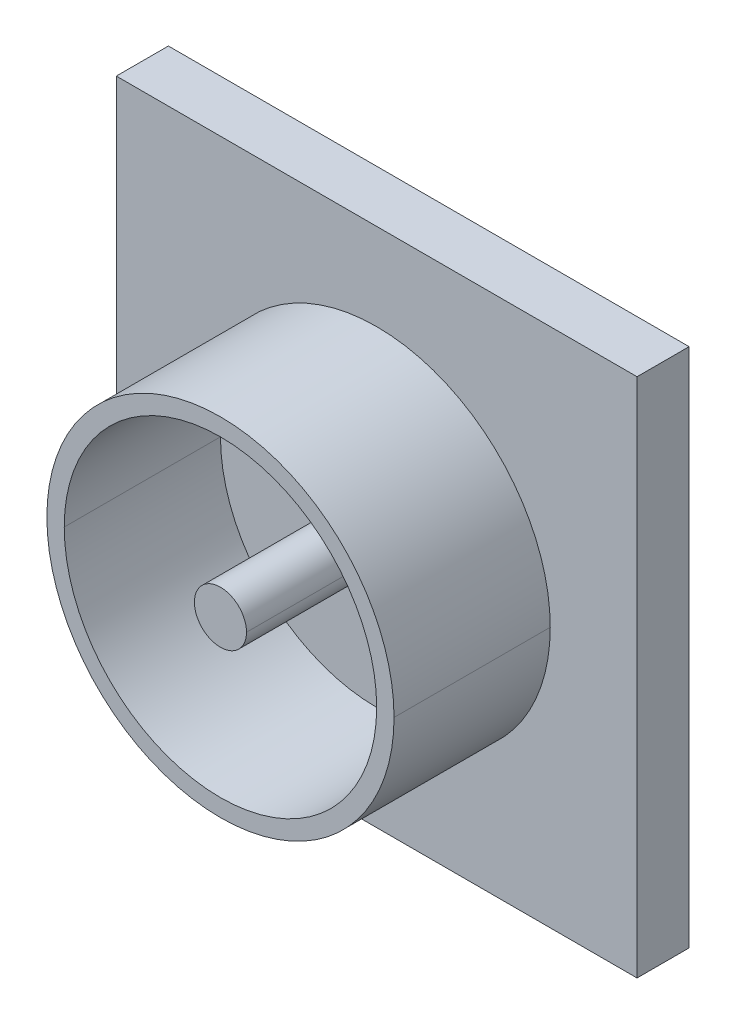
ISO-10303-21;
HEADER;
FILE_DESCRIPTION(('STEP AP214'),'2;1');
FILE_NAME('part.step','',(''),(''),'','','');
FILE_SCHEMA(('AUTOMOTIVE_DESIGN { 1 0 10303 214 1 1 1 1 }'));
ENDSEC;
DATA;
#1=APPLICATION_CONTEXT('core data for automotive mechanical design processes');
#2=APPLICATION_PROTOCOL_DEFINITION('international standard','automotive_design',2000,#1);
#3=PRODUCT_CONTEXT('',#1,'mechanical');
#4=PRODUCT('Part','Part','',(#3));
#5=PRODUCT_RELATED_PRODUCT_CATEGORY('part','',(#4));
#6=PRODUCT_DEFINITION_FORMATION('','',#4);
#7=PRODUCT_DEFINITION_CONTEXT('part definition',#1,'design');
#8=PRODUCT_DEFINITION('design','',#6,#7);
#9=PRODUCT_DEFINITION_SHAPE('','',#8);
#10=(LENGTH_UNIT() NAMED_UNIT(*) SI_UNIT(.MILLI.,.METRE.));
#11=(NAMED_UNIT(*) PLANE_ANGLE_UNIT() SI_UNIT($,.RADIAN.));
#12=(NAMED_UNIT(*) SI_UNIT($,.STERADIAN.) SOLID_ANGLE_UNIT());
#13=UNCERTAINTY_MEASURE_WITH_UNIT(LENGTH_MEASURE(1.E-05),#10,'distance_accuracy_value','');
#14=(GEOMETRIC_REPRESENTATION_CONTEXT(3) GLOBAL_UNCERTAINTY_ASSIGNED_CONTEXT((#13)) GLOBAL_UNIT_ASSIGNED_CONTEXT((#10,
#11,#12)) REPRESENTATION_CONTEXT('',''));
#15=CARTESIAN_POINT('',(0.,0.,0.));
#16=DIRECTION('',(0.,0.,1.));
#17=DIRECTION('',(1.,0.,0.));
#18=AXIS2_PLACEMENT_3D('',#15,#16,#17);
#19=CARTESIAN_POINT('',(0.,0.,1.2));
#20=DIRECTION('',(0.,0.,-1.));
#21=DIRECTION('',(-1.,0.,0.));
#22=AXIS2_PLACEMENT_3D('',#19,#20,#21);
#23=CYLINDRICAL_SURFACE('',#22,0.15);
#24=CARTESIAN_POINT('',(0.,0.,1.2));
#25=DIRECTION('',(0.,0.,1.));
#26=DIRECTION('',(1.,0.,0.));
#27=AXIS2_PLACEMENT_3D('',#24,#25,#26);
#28=CIRCLE('',#27,0.15);
#29=CARTESIAN_POINT('',(0.15,0.,1.2));
#30=VERTEX_POINT('',#29);
#31=CARTESIAN_POINT('',(-0.15,0.,1.2));
#32=VERTEX_POINT('',#31);
#33=EDGE_CURVE('E11',#30,#32,#28,.T.);
#34=ORIENTED_EDGE('',*,*,#33,.F.);
#35=DIRECTION('',(0.,0.,-1.));
#36=VECTOR('',#35,1.);
#37=CARTESIAN_POINT('',(0.15,0.,1.2));
#38=LINE('',#37,#36);
#39=CARTESIAN_POINT('',(0.15,0.,0.3));
#40=VERTEX_POINT('',#39);
#41=EDGE_CURVE('E24',#30,#40,#38,.T.);
#42=ORIENTED_EDGE('',*,*,#41,.T.);
#43=CARTESIAN_POINT('',(0.,0.,0.3));
#44=DIRECTION('',(0.,0.,1.));
#45=DIRECTION('',(1.,0.,0.));
#46=AXIS2_PLACEMENT_3D('',#43,#44,#45);
#47=CIRCLE('',#46,0.15);
#48=CARTESIAN_POINT('',(-0.15,0.,0.3));
#49=VERTEX_POINT('',#48);
#50=EDGE_CURVE('E160',#40,#49,#47,.T.);
#51=ORIENTED_EDGE('',*,*,#50,.T.);
#52=DIRECTION('',(0.,0.,-1.));
#53=VECTOR('',#52,1.);
#54=CARTESIAN_POINT('',(-0.15,0.,1.2));
#55=LINE('',#54,#53);
#56=EDGE_CURVE('E157',#32,#49,#55,.T.);
#57=ORIENTED_EDGE('',*,*,#56,.F.);
#58=EDGE_LOOP('',(#34,#42,#51,#57));
#59=FACE_BOUND('',#58,.T.);
#60=ADVANCED_FACE('F17',(#59),#23,.T.);
#61=CARTESIAN_POINT('',(0.,0.,1.2));
#62=DIRECTION('',(0.,0.,-1.));
#63=DIRECTION('',(-1.,0.,0.));
#64=AXIS2_PLACEMENT_3D('',#61,#62,#63);
#65=CYLINDRICAL_SURFACE('',#64,1.);
#66=CARTESIAN_POINT('',(0.,0.,1.2));
#67=DIRECTION('',(0.,0.,1.));
#68=DIRECTION('',(1.,0.,0.));
#69=AXIS2_PLACEMENT_3D('',#66,#67,#68);
#70=CIRCLE('',#69,1.);
#71=CARTESIAN_POINT('',(1.,0.,1.2));
#72=VERTEX_POINT('',#71);
#73=CARTESIAN_POINT('',(-1.,0.,1.2));
#74=VERTEX_POINT('',#73);
#75=EDGE_CURVE('E155',#72,#74,#70,.T.);
#76=ORIENTED_EDGE('',*,*,#75,.F.);
#77=DIRECTION('',(0.,0.,-1.));
#78=VECTOR('',#77,1.);
#79=CARTESIAN_POINT('',(1.,0.,1.2));
#80=LINE('',#79,#78);
#81=CARTESIAN_POINT('',(1.,0.,0.3));
#82=VERTEX_POINT('',#81);
#83=EDGE_CURVE('E153',#72,#82,#80,.T.);
#84=ORIENTED_EDGE('',*,*,#83,.T.);
#85=CARTESIAN_POINT('',(0.,0.,0.3));
#86=DIRECTION('',(0.,0.,1.));
#87=DIRECTION('',(1.,0.,0.));
#88=AXIS2_PLACEMENT_3D('',#85,#86,#87);
#89=CIRCLE('',#88,1.);
#90=CARTESIAN_POINT('',(-1.,0.,0.3));
#91=VERTEX_POINT('',#90);
#92=EDGE_CURVE('E151',#82,#91,#89,.T.);
#93=ORIENTED_EDGE('',*,*,#92,.T.);
#94=DIRECTION('',(0.,0.,-1.));
#95=VECTOR('',#94,1.);
#96=CARTESIAN_POINT('',(-1.,0.,1.2));
#97=LINE('',#96,#95);
#98=EDGE_CURVE('E148',#74,#91,#97,.T.);
#99=ORIENTED_EDGE('',*,*,#98,.F.);
#100=EDGE_LOOP('',(#76,#84,#93,#99));
#101=FACE_BOUND('',#100,.T.);
#102=ADVANCED_FACE('F203',(#101),#65,.T.);
#103=CARTESIAN_POINT('',(0.,0.,1.2));
#104=DIRECTION('',(0.,0.,-1.));
#105=DIRECTION('',(-1.,0.,0.));
#106=AXIS2_PLACEMENT_3D('',#103,#104,#105);
#107=CYLINDRICAL_SURFACE('',#106,0.9);
#108=CARTESIAN_POINT('',(0.,0.,1.2));
#109=DIRECTION('',(0.,0.,1.));
#110=DIRECTION('',(1.,0.,0.));
#111=AXIS2_PLACEMENT_3D('',#108,#109,#110);
#112=CIRCLE('',#111,0.9);
#113=CARTESIAN_POINT('',(-0.9,0.,1.2));
#114=VERTEX_POINT('',#113);
#115=CARTESIAN_POINT('',(0.9,0.,1.2));
#116=VERTEX_POINT('',#115);
#117=EDGE_CURVE('E145',#114,#116,#112,.T.);
#118=ORIENTED_EDGE('',*,*,#117,.T.);
#119=DIRECTION('',(0.,0.,-1.));
#120=VECTOR('',#119,1.);
#121=CARTESIAN_POINT('',(0.9,0.,1.2));
#122=LINE('',#121,#120);
#123=CARTESIAN_POINT('',(0.9,0.,0.3));
#124=VERTEX_POINT('',#123);
#125=EDGE_CURVE('E142',#116,#124,#122,.T.);
#126=ORIENTED_EDGE('',*,*,#125,.T.);
#127=CARTESIAN_POINT('',(0.,0.,0.3));
#128=DIRECTION('',(0.,0.,-1.));
#129=DIRECTION('',(1.,0.,0.));
#130=AXIS2_PLACEMENT_3D('',#127,#128,#129);
#131=CIRCLE('',#130,0.9);
#132=CARTESIAN_POINT('',(-0.9,0.,0.3));
#133=VERTEX_POINT('',#132);
#134=EDGE_CURVE('E139',#124,#133,#131,.T.);
#135=ORIENTED_EDGE('',*,*,#134,.T.);
#136=DIRECTION('',(0.,0.,-1.));
#137=VECTOR('',#136,1.);
#138=CARTESIAN_POINT('',(-0.9,0.,1.2));
#139=LINE('',#138,#137);
#140=EDGE_CURVE('E137',#114,#133,#139,.T.);
#141=ORIENTED_EDGE('',*,*,#140,.F.);
#142=EDGE_LOOP('',(#118,#126,#135,#141));
#143=FACE_BOUND('',#142,.T.);
#144=ADVANCED_FACE('F189',(#143),#107,.F.);
#145=CARTESIAN_POINT('',(-1.5,-1.5,0.3));
#146=DIRECTION('',(1.,0.,0.));
#147=DIRECTION('',(0.,0.,-1.));
#148=AXIS2_PLACEMENT_3D('',#145,#146,#147);
#149=PLANE('',#148);
#150=DIRECTION('',(0.,-1.,0.));
#151=VECTOR('',#150,1.);
#152=CARTESIAN_POINT('',(-1.5,-1.5,0.));
#153=LINE('',#152,#151);
#154=CARTESIAN_POINT('',(-1.5,1.5,0.));
#155=VERTEX_POINT('',#154);
#156=CARTESIAN_POINT('',(-1.5,-1.5,0.));
#157=VERTEX_POINT('',#156);
#158=EDGE_CURVE('E135',#155,#157,#153,.T.);
#159=ORIENTED_EDGE('',*,*,#158,.T.);
#160=DIRECTION('',(0.,0.,-1.));
#161=VECTOR('',#160,1.);
#162=CARTESIAN_POINT('',(-1.5,-1.5,0.3));
#163=LINE('',#162,#161);
#164=CARTESIAN_POINT('',(-1.5,-1.5,0.3));
#165=VERTEX_POINT('',#164);
#166=EDGE_CURVE('E132',#165,#157,#163,.T.);
#167=ORIENTED_EDGE('',*,*,#166,.F.);
#168=DIRECTION('',(0.,-1.,0.));
#169=VECTOR('',#168,1.);
#170=CARTESIAN_POINT('',(-1.5,-1.5,0.3));
#171=LINE('',#170,#169);
#172=CARTESIAN_POINT('',(-1.5,1.5,0.3));
#173=VERTEX_POINT('',#172);
#174=EDGE_CURVE('E130',#173,#165,#171,.T.);
#175=ORIENTED_EDGE('',*,*,#174,.F.);
#176=DIRECTION('',(0.,0.,-1.));
#177=VECTOR('',#176,1.);
#178=CARTESIAN_POINT('',(-1.5,1.5,0.3));
#179=LINE('',#178,#177);
#180=EDGE_CURVE('E114',#173,#155,#179,.T.);
#181=ORIENTED_EDGE('',*,*,#180,.T.);
#182=EDGE_LOOP('',(#159,#167,#175,#181));
#183=FACE_BOUND('',#182,.T.);
#184=ADVANCED_FACE('F211',(#183),#149,.F.);
#185=CARTESIAN_POINT('',(1.5,-1.5,0.3));
#186=DIRECTION('',(0.,1.,0.));
#187=DIRECTION('',(-1.,0.,0.));
#188=AXIS2_PLACEMENT_3D('',#185,#186,#187);
#189=PLANE('',#188);
#190=DIRECTION('',(1.,0.,0.));
#191=VECTOR('',#190,1.);
#192=CARTESIAN_POINT('',(1.5,-1.5,0.));
#193=LINE('',#192,#191);
#194=CARTESIAN_POINT('',(1.5,-1.5,0.));
#195=VERTEX_POINT('',#194);
#196=EDGE_CURVE('E127',#157,#195,#193,.T.);
#197=ORIENTED_EDGE('',*,*,#196,.T.);
#198=DIRECTION('',(0.,0.,-1.));
#199=VECTOR('',#198,1.);
#200=CARTESIAN_POINT('',(1.5,-1.5,0.3));
#201=LINE('',#200,#199);
#202=CARTESIAN_POINT('',(1.5,-1.5,0.3));
#203=VERTEX_POINT('',#202);
#204=EDGE_CURVE('E125',#203,#195,#201,.T.);
#205=ORIENTED_EDGE('',*,*,#204,.F.);
#206=DIRECTION('',(1.,0.,0.));
#207=VECTOR('',#206,1.);
#208=CARTESIAN_POINT('',(1.5,-1.5,0.3));
#209=LINE('',#208,#207);
#210=EDGE_CURVE('E108',#165,#203,#209,.T.);
#211=ORIENTED_EDGE('',*,*,#210,.F.);
#212=ORIENTED_EDGE('',*,*,#166,.T.);
#213=EDGE_LOOP('',(#197,#205,#211,#212));
#214=FACE_BOUND('',#213,.T.);
#215=ADVANCED_FACE('F216',(#214),#189,.F.);
#216=CARTESIAN_POINT('',(1.5,-1.5,0.3));
#217=DIRECTION('',(-1.,0.,0.));
#218=DIRECTION('',(0.,0.,1.));
#219=AXIS2_PLACEMENT_3D('',#216,#217,#218);
#220=PLANE('',#219);
#221=DIRECTION('',(0.,1.,0.));
#222=VECTOR('',#221,1.);
#223=CARTESIAN_POINT('',(1.5,-1.5,0.));
#224=LINE('',#223,#222);
#225=CARTESIAN_POINT('',(1.5,1.5,0.));
#226=VERTEX_POINT('',#225);
#227=EDGE_CURVE('E95',#195,#226,#224,.T.);
#228=ORIENTED_EDGE('',*,*,#227,.T.);
#229=DIRECTION('',(0.,0.,-1.));
#230=VECTOR('',#229,1.);
#231=CARTESIAN_POINT('',(1.5,1.5,0.3));
#232=LINE('',#231,#230);
#233=CARTESIAN_POINT('',(1.5,1.5,0.3));
#234=VERTEX_POINT('',#233);
#235=EDGE_CURVE('E89',#234,#226,#232,.T.);
#236=ORIENTED_EDGE('',*,*,#235,.F.);
#237=DIRECTION('',(0.,1.,0.));
#238=VECTOR('',#237,1.);
#239=CARTESIAN_POINT('',(1.5,-1.5,0.3));
#240=LINE('',#239,#238);
#241=EDGE_CURVE('E93',#203,#234,#240,.T.);
#242=ORIENTED_EDGE('',*,*,#241,.F.);
#243=ORIENTED_EDGE('',*,*,#204,.T.);
#244=EDGE_LOOP('',(#228,#236,#242,#243));
#245=FACE_BOUND('',#244,.T.);
#246=ADVANCED_FACE('F91',(#245),#220,.F.);
#247=CARTESIAN_POINT('',(1.5,1.5,0.3));
#248=DIRECTION('',(0.,-1.,0.));
#249=DIRECTION('',(1.,0.,0.));
#250=AXIS2_PLACEMENT_3D('',#247,#248,#249);
#251=PLANE('',#250);
#252=DIRECTION('',(-1.,0.,0.));
#253=VECTOR('',#252,1.);
#254=CARTESIAN_POINT('',(1.5,1.5,0.));
#255=LINE('',#254,#253);
#256=EDGE_CURVE('E109',#226,#155,#255,.T.);
#257=ORIENTED_EDGE('',*,*,#256,.T.);
#258=ORIENTED_EDGE('',*,*,#180,.F.);
#259=DIRECTION('',(-1.,0.,0.));
#260=VECTOR('',#259,1.);
#261=CARTESIAN_POINT('',(1.5,1.5,0.3));
#262=LINE('',#261,#260);
#263=EDGE_CURVE('E106',#234,#173,#262,.T.);
#264=ORIENTED_EDGE('',*,*,#263,.F.);
#265=ORIENTED_EDGE('',*,*,#235,.T.);
#266=EDGE_LOOP('',(#257,#258,#264,#265));
#267=FACE_BOUND('',#266,.T.);
#268=ADVANCED_FACE('F112',(#267),#251,.F.);
#269=CARTESIAN_POINT('',(0.,0.,0.3));
#270=DIRECTION('',(0.,0.,1.));
#271=DIRECTION('',(1.,0.,0.));
#272=AXIS2_PLACEMENT_3D('',#269,#270,#271);
#273=PLANE('',#272);
#274=CARTESIAN_POINT('',(0.,0.,0.3));
#275=DIRECTION('',(0.,0.,1.));
#276=DIRECTION('',(1.,0.,0.));
#277=AXIS2_PLACEMENT_3D('',#274,#275,#276);
#278=CIRCLE('',#277,1.);
#279=EDGE_CURVE('E115',#91,#82,#278,.T.);
#280=ORIENTED_EDGE('',*,*,#279,.F.);
#281=ORIENTED_EDGE('',*,*,#92,.F.);
#282=EDGE_LOOP('',(#280,#281));
#283=FACE_BOUND('',#282,.T.);
#284=ORIENTED_EDGE('',*,*,#174,.T.);
#285=ORIENTED_EDGE('',*,*,#210,.T.);
#286=ORIENTED_EDGE('',*,*,#241,.T.);
#287=ORIENTED_EDGE('',*,*,#263,.T.);
#288=EDGE_LOOP('',(#284,#285,#286,#287));
#289=FACE_BOUND('',#288,.T.);
#290=ADVANCED_FACE('F105',(#283,#289),#273,.T.);
#291=CARTESIAN_POINT('',(0.,0.,0.));
#292=DIRECTION('',(0.,0.,1.));
#293=DIRECTION('',(1.,0.,0.));
#294=AXIS2_PLACEMENT_3D('',#291,#292,#293);
#295=PLANE('',#294);
#296=ORIENTED_EDGE('',*,*,#158,.F.);
#297=ORIENTED_EDGE('',*,*,#256,.F.);
#298=ORIENTED_EDGE('',*,*,#227,.F.);
#299=ORIENTED_EDGE('',*,*,#196,.F.);
#300=EDGE_LOOP('',(#296,#297,#298,#299));
#301=FACE_BOUND('',#300,.T.);
#302=ADVANCED_FACE('F227',(#301),#295,.F.);
#303=CARTESIAN_POINT('',(0.,0.,1.2));
#304=DIRECTION('',(0.,0.,-1.));
#305=DIRECTION('',(-1.,0.,0.));
#306=AXIS2_PLACEMENT_3D('',#303,#304,#305);
#307=CYLINDRICAL_SURFACE('',#306,0.9);
#308=ORIENTED_EDGE('',*,*,#125,.F.);
#309=CARTESIAN_POINT('',(0.,0.,1.2));
#310=DIRECTION('',(0.,0.,1.));
#311=DIRECTION('',(1.,0.,0.));
#312=AXIS2_PLACEMENT_3D('',#309,#310,#311);
#313=CIRCLE('',#312,0.9);
#314=EDGE_CURVE('E119',#116,#114,#313,.T.);
#315=ORIENTED_EDGE('',*,*,#314,.T.);
#316=ORIENTED_EDGE('',*,*,#140,.T.);
#317=CARTESIAN_POINT('',(0.,0.,0.3));
#318=DIRECTION('',(0.,0.,-1.));
#319=DIRECTION('',(1.,0.,0.));
#320=AXIS2_PLACEMENT_3D('',#317,#318,#319);
#321=CIRCLE('',#320,0.9);
#322=EDGE_CURVE('E175',#133,#124,#321,.T.);
#323=ORIENTED_EDGE('',*,*,#322,.T.);
#324=EDGE_LOOP('',(#308,#315,#316,#323));
#325=FACE_BOUND('',#324,.T.);
#326=ADVANCED_FACE('F183',(#325),#307,.F.);
#327=CARTESIAN_POINT('',(0.,0.,1.2));
#328=DIRECTION('',(0.,0.,-1.));
#329=DIRECTION('',(-1.,0.,0.));
#330=AXIS2_PLACEMENT_3D('',#327,#328,#329);
#331=CYLINDRICAL_SURFACE('',#330,1.);
#332=ORIENTED_EDGE('',*,*,#83,.F.);
#333=CARTESIAN_POINT('',(0.,0.,1.2));
#334=DIRECTION('',(0.,0.,1.));
#335=DIRECTION('',(1.,0.,0.));
#336=AXIS2_PLACEMENT_3D('',#333,#334,#335);
#337=CIRCLE('',#336,1.);
#338=EDGE_CURVE('E171',#74,#72,#337,.T.);
#339=ORIENTED_EDGE('',*,*,#338,.F.);
#340=ORIENTED_EDGE('',*,*,#98,.T.);
#341=ORIENTED_EDGE('',*,*,#279,.T.);
#342=EDGE_LOOP('',(#332,#339,#340,#341));
#343=FACE_BOUND('',#342,.T.);
#344=ADVANCED_FACE('F200',(#343),#331,.T.);
#345=CARTESIAN_POINT('',(0.,0.,1.2));
#346=DIRECTION('',(0.,0.,1.));
#347=DIRECTION('',(1.,0.,0.));
#348=AXIS2_PLACEMENT_3D('',#345,#346,#347);
#349=PLANE('',#348);
#350=ORIENTED_EDGE('',*,*,#117,.F.);
#351=ORIENTED_EDGE('',*,*,#314,.F.);
#352=EDGE_LOOP('',(#350,#351));
#353=FACE_BOUND('',#352,.T.);
#354=ORIENTED_EDGE('',*,*,#338,.T.);
#355=ORIENTED_EDGE('',*,*,#75,.T.);
#356=EDGE_LOOP('',(#354,#355));
#357=FACE_BOUND('',#356,.T.);
#358=ADVANCED_FACE('F186',(#353,#357),#349,.T.);
#359=CARTESIAN_POINT('',(0.,0.,0.3));
#360=DIRECTION('',(0.,0.,1.));
#361=DIRECTION('',(1.,0.,0.));
#362=AXIS2_PLACEMENT_3D('',#359,#360,#361);
#363=PLANE('',#362);
#364=CARTESIAN_POINT('',(0.,0.,0.3));
#365=DIRECTION('',(0.,0.,1.));
#366=DIRECTION('',(1.,0.,0.));
#367=AXIS2_PLACEMENT_3D('',#364,#365,#366);
#368=CIRCLE('',#367,0.15);
#369=EDGE_CURVE('E169',#49,#40,#368,.T.);
#370=ORIENTED_EDGE('',*,*,#369,.F.);
#371=ORIENTED_EDGE('',*,*,#50,.F.);
#372=EDGE_LOOP('',(#370,#371));
#373=FACE_BOUND('',#372,.T.);
#374=ORIENTED_EDGE('',*,*,#322,.F.);
#375=ORIENTED_EDGE('',*,*,#134,.F.);
#376=EDGE_LOOP('',(#374,#375));
#377=FACE_BOUND('',#376,.T.);
#378=ADVANCED_FACE('F167',(#373,#377),#363,.T.);
#379=CARTESIAN_POINT('',(0.,0.,1.2));
#380=DIRECTION('',(0.,0.,-1.));
#381=DIRECTION('',(-1.,0.,0.));
#382=AXIS2_PLACEMENT_3D('',#379,#380,#381);
#383=CYLINDRICAL_SURFACE('',#382,0.15);
#384=ORIENTED_EDGE('',*,*,#41,.F.);
#385=CARTESIAN_POINT('',(0.,0.,1.2));
#386=DIRECTION('',(0.,0.,1.));
#387=DIRECTION('',(1.,0.,0.));
#388=AXIS2_PLACEMENT_3D('',#385,#386,#387);
#389=CIRCLE('',#388,0.15);
#390=EDGE_CURVE('E172',#32,#30,#389,.T.);
#391=ORIENTED_EDGE('',*,*,#390,.F.);
#392=ORIENTED_EDGE('',*,*,#56,.T.);
#393=ORIENTED_EDGE('',*,*,#369,.T.);
#394=EDGE_LOOP('',(#384,#391,#392,#393));
#395=FACE_BOUND('',#394,.T.);
#396=ADVANCED_FACE('F170',(#395),#383,.T.);
#397=CARTESIAN_POINT('',(0.,0.,1.2));
#398=DIRECTION('',(0.,0.,1.));
#399=DIRECTION('',(1.,0.,0.));
#400=AXIS2_PLACEMENT_3D('',#397,#398,#399);
#401=PLANE('',#400);
#402=ORIENTED_EDGE('',*,*,#390,.T.);
#403=ORIENTED_EDGE('',*,*,#33,.T.);
#404=EDGE_LOOP('',(#402,#403));
#405=FACE_BOUND('',#404,.T.);
#406=ADVANCED_FACE('F198',(#405),#401,.T.);
#407=CLOSED_SHELL('',(#60,#102,#144,#184,#215,#246,#268,#290,#302,#326,#344,#358,#378,#396,#406));
#408=MANIFOLD_SOLID_BREP('B1',#407);
#409=ADVANCED_BREP_SHAPE_REPRESENTATION('',(#18,#408),#14);
#410=SHAPE_DEFINITION_REPRESENTATION(#9,#409);
ENDSEC;
END-ISO-10303-21;
